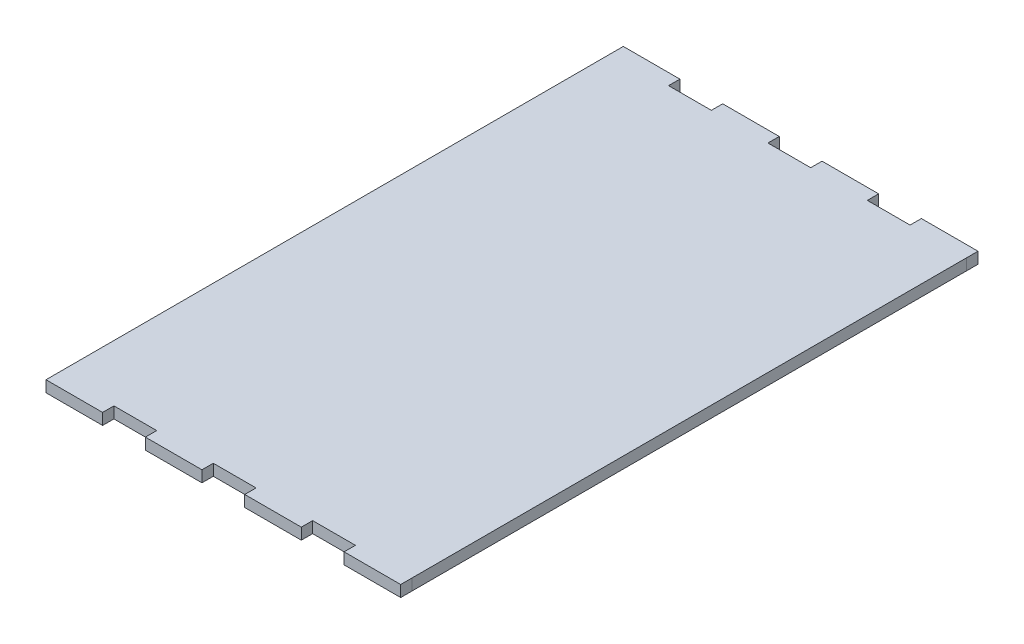
ISO-10303-21;
HEADER;
FILE_DESCRIPTION(('STEP AP214'),'2;1');
FILE_NAME('part.step','',(''),(''),'','','');
FILE_SCHEMA(('AUTOMOTIVE_DESIGN { 1 0 10303 214 1 1 1 1 }'));
ENDSEC;
DATA;
#1=APPLICATION_CONTEXT('core data for automotive mechanical design processes');
#2=APPLICATION_PROTOCOL_DEFINITION('international standard','automotive_design',2000,#1);
#3=PRODUCT_CONTEXT('',#1,'mechanical');
#4=PRODUCT('Part','Part','',(#3));
#5=PRODUCT_RELATED_PRODUCT_CATEGORY('part','',(#4));
#6=PRODUCT_DEFINITION_FORMATION('','',#4);
#7=PRODUCT_DEFINITION_CONTEXT('part definition',#1,'design');
#8=PRODUCT_DEFINITION('design','',#6,#7);
#9=PRODUCT_DEFINITION_SHAPE('','',#8);
#10=(LENGTH_UNIT() NAMED_UNIT(*) SI_UNIT(.MILLI.,.METRE.));
#11=(NAMED_UNIT(*) PLANE_ANGLE_UNIT() SI_UNIT($,.RADIAN.));
#12=(NAMED_UNIT(*) SI_UNIT($,.STERADIAN.) SOLID_ANGLE_UNIT());
#13=UNCERTAINTY_MEASURE_WITH_UNIT(LENGTH_MEASURE(1.E-05),#10,'distance_accuracy_value','');
#14=(GEOMETRIC_REPRESENTATION_CONTEXT(3) GLOBAL_UNCERTAINTY_ASSIGNED_CONTEXT((#13)) GLOBAL_UNIT_ASSIGNED_CONTEXT((#10,
#11,#12)) REPRESENTATION_CONTEXT('',''));
#15=CARTESIAN_POINT('',(0.,0.,0.));
#16=DIRECTION('',(0.,0.,1.));
#17=DIRECTION('',(1.,0.,0.));
#18=AXIS2_PLACEMENT_3D('',#15,#16,#17);
#19=CARTESIAN_POINT('',(0.,6.,6.));
#20=DIRECTION('',(0.,0.,-1.));
#21=DIRECTION('',(-1.,0.,0.));
#22=AXIS2_PLACEMENT_3D('',#19,#20,#21);
#23=PLANE('',#22);
#24=DIRECTION('',(1.,0.,0.));
#25=VECTOR('',#24,1.);
#26=CARTESIAN_POINT('',(0.,0.,6.));
#27=LINE('',#26,#25);
#28=CARTESIAN_POINT('',(0.,0.,6.));
#29=VERTEX_POINT('',#28);
#30=CARTESIAN_POINT('',(30.,0.,6.));
#31=VERTEX_POINT('',#30);
#32=EDGE_CURVE('E291',#29,#31,#27,.T.);
#33=ORIENTED_EDGE('',*,*,#32,.T.);
#34=DIRECTION('',(0.,-1.,0.));
#35=VECTOR('',#34,1.);
#36=CARTESIAN_POINT('',(30.,6.,6.));
#37=LINE('',#36,#35);
#38=CARTESIAN_POINT('',(30.,6.,6.));
#39=VERTEX_POINT('',#38);
#40=EDGE_CURVE('E50',#39,#31,#37,.T.);
#41=ORIENTED_EDGE('',*,*,#40,.F.);
#42=DIRECTION('',(1.,0.,0.));
#43=VECTOR('',#42,1.);
#44=CARTESIAN_POINT('',(0.,6.,6.));
#45=LINE('',#44,#43);
#46=CARTESIAN_POINT('',(0.,6.,6.));
#47=VERTEX_POINT('',#46);
#48=EDGE_CURVE('E175',#47,#39,#45,.T.);
#49=ORIENTED_EDGE('',*,*,#48,.F.);
#50=DIRECTION('',(0.,-1.,0.));
#51=VECTOR('',#50,1.);
#52=CARTESIAN_POINT('',(0.,6.,6.));
#53=LINE('',#52,#51);
#54=EDGE_CURVE('E11',#47,#29,#53,.T.);
#55=ORIENTED_EDGE('',*,*,#54,.T.);
#56=EDGE_LOOP('',(#33,#41,#49,#55));
#57=FACE_BOUND('',#56,.T.);
#58=ADVANCED_FACE('F41',(#57),#23,.F.);
#59=CARTESIAN_POINT('',(30.,6.,0.));
#60=DIRECTION('',(-1.,0.,0.));
#61=DIRECTION('',(0.,0.,1.));
#62=AXIS2_PLACEMENT_3D('',#59,#60,#61);
#63=PLANE('',#62);
#64=DIRECTION('',(0.,0.,-1.));
#65=VECTOR('',#64,1.);
#66=CARTESIAN_POINT('',(30.,0.,0.));
#67=LINE('',#66,#65);
#68=CARTESIAN_POINT('',(30.,0.,0.));
#69=VERTEX_POINT('',#68);
#70=EDGE_CURVE('E294',#31,#69,#67,.T.);
#71=ORIENTED_EDGE('',*,*,#70,.T.);
#72=DIRECTION('',(0.,-1.,0.));
#73=VECTOR('',#72,1.);
#74=CARTESIAN_POINT('',(30.,6.,0.));
#75=LINE('',#74,#73);
#76=CARTESIAN_POINT('',(30.,6.,0.));
#77=VERTEX_POINT('',#76);
#78=EDGE_CURVE('E490',#77,#69,#75,.T.);
#79=ORIENTED_EDGE('',*,*,#78,.F.);
#80=DIRECTION('',(0.,0.,-1.));
#81=VECTOR('',#80,1.);
#82=CARTESIAN_POINT('',(30.,6.,0.));
#83=LINE('',#82,#81);
#84=EDGE_CURVE('E500',#39,#77,#83,.T.);
#85=ORIENTED_EDGE('',*,*,#84,.F.);
#86=ORIENTED_EDGE('',*,*,#40,.T.);
#87=EDGE_LOOP('',(#71,#79,#85,#86));
#88=FACE_BOUND('',#87,.T.);
#89=ADVANCED_FACE('F498',(#88),#63,.F.);
#90=CARTESIAN_POINT('',(30.,6.,0.));
#91=DIRECTION('',(0.,0.,-1.));
#92=DIRECTION('',(-1.,0.,0.));
#93=AXIS2_PLACEMENT_3D('',#90,#91,#92);
#94=PLANE('',#93);
#95=DIRECTION('',(1.,0.,0.));
#96=VECTOR('',#95,1.);
#97=CARTESIAN_POINT('',(30.,0.,0.));
#98=LINE('',#97,#96);
#99=CARTESIAN_POINT('',(52.67,0.,0.));
#100=VERTEX_POINT('',#99);
#101=EDGE_CURVE('E297',#69,#100,#98,.T.);
#102=ORIENTED_EDGE('',*,*,#101,.T.);
#103=DIRECTION('',(0.,-1.,0.));
#104=VECTOR('',#103,1.);
#105=CARTESIAN_POINT('',(52.67,6.,0.));
#106=LINE('',#105,#104);
#107=CARTESIAN_POINT('',(52.67,6.,0.));
#108=VERTEX_POINT('',#107);
#109=EDGE_CURVE('E486',#108,#100,#106,.T.);
#110=ORIENTED_EDGE('',*,*,#109,.F.);
#111=DIRECTION('',(1.,0.,0.));
#112=VECTOR('',#111,1.);
#113=CARTESIAN_POINT('',(30.,6.,0.));
#114=LINE('',#113,#112);
#115=EDGE_CURVE('E517',#77,#108,#114,.T.);
#116=ORIENTED_EDGE('',*,*,#115,.F.);
#117=ORIENTED_EDGE('',*,*,#78,.T.);
#118=EDGE_LOOP('',(#102,#110,#116,#117));
#119=FACE_BOUND('',#118,.T.);
#120=ADVANCED_FACE('F507',(#119),#94,.F.);
#121=CARTESIAN_POINT('',(52.67,6.,0.));
#122=DIRECTION('',(1.,0.,0.));
#123=DIRECTION('',(0.,0.,-1.));
#124=AXIS2_PLACEMENT_3D('',#121,#122,#123);
#125=PLANE('',#124);
#126=DIRECTION('',(0.,0.,1.));
#127=VECTOR('',#126,1.);
#128=CARTESIAN_POINT('',(52.67,0.,0.));
#129=LINE('',#128,#127);
#130=CARTESIAN_POINT('',(52.67,0.,6.));
#131=VERTEX_POINT('',#130);
#132=EDGE_CURVE('E300',#100,#131,#129,.T.);
#133=ORIENTED_EDGE('',*,*,#132,.T.);
#134=DIRECTION('',(0.,-1.,0.));
#135=VECTOR('',#134,1.);
#136=CARTESIAN_POINT('',(52.67,6.,6.));
#137=LINE('',#136,#135);
#138=CARTESIAN_POINT('',(52.67,6.,6.));
#139=VERTEX_POINT('',#138);
#140=EDGE_CURVE('E482',#139,#131,#137,.T.);
#141=ORIENTED_EDGE('',*,*,#140,.F.);
#142=DIRECTION('',(0.,0.,1.));
#143=VECTOR('',#142,1.);
#144=CARTESIAN_POINT('',(52.67,6.,0.));
#145=LINE('',#144,#143);
#146=EDGE_CURVE('E513',#108,#139,#145,.T.);
#147=ORIENTED_EDGE('',*,*,#146,.F.);
#148=ORIENTED_EDGE('',*,*,#109,.T.);
#149=EDGE_LOOP('',(#133,#141,#147,#148));
#150=FACE_BOUND('',#149,.T.);
#151=ADVANCED_FACE('F511',(#150),#125,.F.);
#152=CARTESIAN_POINT('',(52.67,6.,6.));
#153=DIRECTION('',(0.,0.,-1.));
#154=DIRECTION('',(-1.,0.,0.));
#155=AXIS2_PLACEMENT_3D('',#152,#153,#154);
#156=PLANE('',#155);
#157=DIRECTION('',(1.,0.,0.));
#158=VECTOR('',#157,1.);
#159=CARTESIAN_POINT('',(52.67,0.,6.));
#160=LINE('',#159,#158);
#161=CARTESIAN_POINT('',(82.67,0.,6.));
#162=VERTEX_POINT('',#161);
#163=EDGE_CURVE('E303',#131,#162,#160,.T.);
#164=ORIENTED_EDGE('',*,*,#163,.T.);
#165=DIRECTION('',(0.,-1.,0.));
#166=VECTOR('',#165,1.);
#167=CARTESIAN_POINT('',(82.67,6.,6.));
#168=LINE('',#167,#166);
#169=CARTESIAN_POINT('',(82.67,6.,6.));
#170=VERTEX_POINT('',#169);
#171=EDGE_CURVE('E478',#170,#162,#168,.T.);
#172=ORIENTED_EDGE('',*,*,#171,.F.);
#173=DIRECTION('',(1.,0.,0.));
#174=VECTOR('',#173,1.);
#175=CARTESIAN_POINT('',(52.67,6.,6.));
#176=LINE('',#175,#174);
#177=EDGE_CURVE('E516',#139,#170,#176,.T.);
#178=ORIENTED_EDGE('',*,*,#177,.F.);
#179=ORIENTED_EDGE('',*,*,#140,.T.);
#180=EDGE_LOOP('',(#164,#172,#178,#179));
#181=FACE_BOUND('',#180,.T.);
#182=ADVANCED_FACE('F616',(#181),#156,.F.);
#183=CARTESIAN_POINT('',(82.67,6.,0.));
#184=DIRECTION('',(-1.,0.,0.));
#185=DIRECTION('',(0.,0.,1.));
#186=AXIS2_PLACEMENT_3D('',#183,#184,#185);
#187=PLANE('',#186);
#188=DIRECTION('',(0.,0.,-1.));
#189=VECTOR('',#188,1.);
#190=CARTESIAN_POINT('',(82.67,0.,0.));
#191=LINE('',#190,#189);
#192=CARTESIAN_POINT('',(82.67,0.,0.));
#193=VERTEX_POINT('',#192);
#194=EDGE_CURVE('E306',#162,#193,#191,.T.);
#195=ORIENTED_EDGE('',*,*,#194,.T.);
#196=DIRECTION('',(0.,-1.,0.));
#197=VECTOR('',#196,1.);
#198=CARTESIAN_POINT('',(82.67,6.,0.));
#199=LINE('',#198,#197);
#200=CARTESIAN_POINT('',(82.67,6.,0.));
#201=VERTEX_POINT('',#200);
#202=EDGE_CURVE('E474',#201,#193,#199,.T.);
#203=ORIENTED_EDGE('',*,*,#202,.F.);
#204=DIRECTION('',(0.,0.,-1.));
#205=VECTOR('',#204,1.);
#206=CARTESIAN_POINT('',(82.67,6.,0.));
#207=LINE('',#206,#205);
#208=EDGE_CURVE('E521',#170,#201,#207,.T.);
#209=ORIENTED_EDGE('',*,*,#208,.F.);
#210=ORIENTED_EDGE('',*,*,#171,.T.);
#211=EDGE_LOOP('',(#195,#203,#209,#210));
#212=FACE_BOUND('',#211,.T.);
#213=ADVANCED_FACE('F619',(#212),#187,.F.);
#214=CARTESIAN_POINT('',(82.67,6.,0.));
#215=DIRECTION('',(0.,0.,-1.));
#216=DIRECTION('',(-1.,0.,0.));
#217=AXIS2_PLACEMENT_3D('',#214,#215,#216);
#218=PLANE('',#217);
#219=DIRECTION('',(1.,0.,0.));
#220=VECTOR('',#219,1.);
#221=CARTESIAN_POINT('',(82.67,0.,0.));
#222=LINE('',#221,#220);
#223=CARTESIAN_POINT('',(105.34,0.,0.));
#224=VERTEX_POINT('',#223);
#225=EDGE_CURVE('E309',#193,#224,#222,.T.);
#226=ORIENTED_EDGE('',*,*,#225,.T.);
#227=DIRECTION('',(0.,-1.,0.));
#228=VECTOR('',#227,1.);
#229=CARTESIAN_POINT('',(105.34,6.,0.));
#230=LINE('',#229,#228);
#231=CARTESIAN_POINT('',(105.34,6.,0.));
#232=VERTEX_POINT('',#231);
#233=EDGE_CURVE('E470',#232,#224,#230,.T.);
#234=ORIENTED_EDGE('',*,*,#233,.F.);
#235=DIRECTION('',(1.,0.,0.));
#236=VECTOR('',#235,1.);
#237=CARTESIAN_POINT('',(82.67,6.,0.));
#238=LINE('',#237,#236);
#239=EDGE_CURVE('E528',#201,#232,#238,.T.);
#240=ORIENTED_EDGE('',*,*,#239,.F.);
#241=ORIENTED_EDGE('',*,*,#202,.T.);
#242=EDGE_LOOP('',(#226,#234,#240,#241));
#243=FACE_BOUND('',#242,.T.);
#244=ADVANCED_FACE('F623',(#243),#218,.F.);
#245=CARTESIAN_POINT('',(105.34,6.,0.));
#246=DIRECTION('',(1.,0.,0.));
#247=DIRECTION('',(0.,0.,-1.));
#248=AXIS2_PLACEMENT_3D('',#245,#246,#247);
#249=PLANE('',#248);
#250=DIRECTION('',(0.,0.,1.));
#251=VECTOR('',#250,1.);
#252=CARTESIAN_POINT('',(105.34,0.,0.));
#253=LINE('',#252,#251);
#254=CARTESIAN_POINT('',(105.34,0.,6.));
#255=VERTEX_POINT('',#254);
#256=EDGE_CURVE('E312',#224,#255,#253,.T.);
#257=ORIENTED_EDGE('',*,*,#256,.T.);
#258=DIRECTION('',(0.,-1.,0.));
#259=VECTOR('',#258,1.);
#260=CARTESIAN_POINT('',(105.34,6.,6.));
#261=LINE('',#260,#259);
#262=CARTESIAN_POINT('',(105.34,6.,6.));
#263=VERTEX_POINT('',#262);
#264=EDGE_CURVE('E466',#263,#255,#261,.T.);
#265=ORIENTED_EDGE('',*,*,#264,.F.);
#266=DIRECTION('',(0.,0.,1.));
#267=VECTOR('',#266,1.);
#268=CARTESIAN_POINT('',(105.34,6.,0.));
#269=LINE('',#268,#267);
#270=EDGE_CURVE('E531',#232,#263,#269,.T.);
#271=ORIENTED_EDGE('',*,*,#270,.F.);
#272=ORIENTED_EDGE('',*,*,#233,.T.);
#273=EDGE_LOOP('',(#257,#265,#271,#272));
#274=FACE_BOUND('',#273,.T.);
#275=ADVANCED_FACE('F627',(#274),#249,.F.);
#276=CARTESIAN_POINT('',(105.34,6.,6.));
#277=DIRECTION('',(0.,0.,-1.));
#278=DIRECTION('',(-1.,0.,0.));
#279=AXIS2_PLACEMENT_3D('',#276,#277,#278);
#280=PLANE('',#279);
#281=DIRECTION('',(1.,0.,0.));
#282=VECTOR('',#281,1.);
#283=CARTESIAN_POINT('',(105.34,0.,6.));
#284=LINE('',#283,#282);
#285=CARTESIAN_POINT('',(135.34,0.,6.));
#286=VERTEX_POINT('',#285);
#287=EDGE_CURVE('E315',#255,#286,#284,.T.);
#288=ORIENTED_EDGE('',*,*,#287,.T.);
#289=DIRECTION('',(0.,-1.,0.));
#290=VECTOR('',#289,1.);
#291=CARTESIAN_POINT('',(135.34,6.,6.));
#292=LINE('',#291,#290);
#293=CARTESIAN_POINT('',(135.34,6.,6.));
#294=VERTEX_POINT('',#293);
#295=EDGE_CURVE('E462',#294,#286,#292,.T.);
#296=ORIENTED_EDGE('',*,*,#295,.F.);
#297=DIRECTION('',(1.,0.,0.));
#298=VECTOR('',#297,1.);
#299=CARTESIAN_POINT('',(105.34,6.,6.));
#300=LINE('',#299,#298);
#301=EDGE_CURVE('E534',#263,#294,#300,.T.);
#302=ORIENTED_EDGE('',*,*,#301,.F.);
#303=ORIENTED_EDGE('',*,*,#264,.T.);
#304=EDGE_LOOP('',(#288,#296,#302,#303));
#305=FACE_BOUND('',#304,.T.);
#306=ADVANCED_FACE('F631',(#305),#280,.F.);
#307=CARTESIAN_POINT('',(135.34,6.,0.));
#308=DIRECTION('',(-1.,0.,0.));
#309=DIRECTION('',(0.,0.,1.));
#310=AXIS2_PLACEMENT_3D('',#307,#308,#309);
#311=PLANE('',#310);
#312=DIRECTION('',(0.,0.,-1.));
#313=VECTOR('',#312,1.);
#314=CARTESIAN_POINT('',(135.34,0.,0.));
#315=LINE('',#314,#313);
#316=CARTESIAN_POINT('',(135.34,0.,0.));
#317=VERTEX_POINT('',#316);
#318=EDGE_CURVE('E318',#286,#317,#315,.T.);
#319=ORIENTED_EDGE('',*,*,#318,.T.);
#320=DIRECTION('',(0.,-1.,0.));
#321=VECTOR('',#320,1.);
#322=CARTESIAN_POINT('',(135.34,6.,0.));
#323=LINE('',#322,#321);
#324=CARTESIAN_POINT('',(135.34,6.,0.));
#325=VERTEX_POINT('',#324);
#326=EDGE_CURVE('E458',#325,#317,#323,.T.);
#327=ORIENTED_EDGE('',*,*,#326,.F.);
#328=DIRECTION('',(0.,0.,-1.));
#329=VECTOR('',#328,1.);
#330=CARTESIAN_POINT('',(135.34,6.,0.));
#331=LINE('',#330,#329);
#332=EDGE_CURVE('E537',#294,#325,#331,.T.);
#333=ORIENTED_EDGE('',*,*,#332,.F.);
#334=ORIENTED_EDGE('',*,*,#295,.T.);
#335=EDGE_LOOP('',(#319,#327,#333,#334));
#336=FACE_BOUND('',#335,.T.);
#337=ADVANCED_FACE('F635',(#336),#311,.F.);
#338=CARTESIAN_POINT('',(135.34,6.,0.));
#339=DIRECTION('',(0.,0.,-1.));
#340=DIRECTION('',(-1.,0.,0.));
#341=AXIS2_PLACEMENT_3D('',#338,#339,#340);
#342=PLANE('',#341);
#343=DIRECTION('',(1.,0.,0.));
#344=VECTOR('',#343,1.);
#345=CARTESIAN_POINT('',(135.34,0.,0.));
#346=LINE('',#345,#344);
#347=CARTESIAN_POINT('',(158.01,0.,0.));
#348=VERTEX_POINT('',#347);
#349=EDGE_CURVE('E321',#317,#348,#346,.T.);
#350=ORIENTED_EDGE('',*,*,#349,.T.);
#351=DIRECTION('',(0.,-1.,0.));
#352=VECTOR('',#351,1.);
#353=CARTESIAN_POINT('',(158.01,6.,0.));
#354=LINE('',#353,#352);
#355=CARTESIAN_POINT('',(158.01,6.,0.));
#356=VERTEX_POINT('',#355);
#357=EDGE_CURVE('E454',#356,#348,#354,.T.);
#358=ORIENTED_EDGE('',*,*,#357,.F.);
#359=DIRECTION('',(1.,0.,0.));
#360=VECTOR('',#359,1.);
#361=CARTESIAN_POINT('',(135.34,6.,0.));
#362=LINE('',#361,#360);
#363=EDGE_CURVE('E540',#325,#356,#362,.T.);
#364=ORIENTED_EDGE('',*,*,#363,.F.);
#365=ORIENTED_EDGE('',*,*,#326,.T.);
#366=EDGE_LOOP('',(#350,#358,#364,#365));
#367=FACE_BOUND('',#366,.T.);
#368=ADVANCED_FACE('F639',(#367),#342,.F.);
#369=CARTESIAN_POINT('',(158.01,6.,0.));
#370=DIRECTION('',(1.,0.,0.));
#371=DIRECTION('',(0.,0.,-1.));
#372=AXIS2_PLACEMENT_3D('',#369,#370,#371);
#373=PLANE('',#372);
#374=DIRECTION('',(0.,0.,1.));
#375=VECTOR('',#374,1.);
#376=CARTESIAN_POINT('',(158.01,0.,0.));
#377=LINE('',#376,#375);
#378=CARTESIAN_POINT('',(158.01,0.,6.));
#379=VERTEX_POINT('',#378);
#380=EDGE_CURVE('E324',#348,#379,#377,.T.);
#381=ORIENTED_EDGE('',*,*,#380,.T.);
#382=DIRECTION('',(0.,-1.,0.));
#383=VECTOR('',#382,1.);
#384=CARTESIAN_POINT('',(158.01,6.,6.));
#385=LINE('',#384,#383);
#386=CARTESIAN_POINT('',(158.01,6.,6.));
#387=VERTEX_POINT('',#386);
#388=EDGE_CURVE('E450',#387,#379,#385,.T.);
#389=ORIENTED_EDGE('',*,*,#388,.F.);
#390=DIRECTION('',(0.,0.,1.));
#391=VECTOR('',#390,1.);
#392=CARTESIAN_POINT('',(158.01,6.,0.));
#393=LINE('',#392,#391);
#394=EDGE_CURVE('E543',#356,#387,#393,.T.);
#395=ORIENTED_EDGE('',*,*,#394,.F.);
#396=ORIENTED_EDGE('',*,*,#357,.T.);
#397=EDGE_LOOP('',(#381,#389,#395,#396));
#398=FACE_BOUND('',#397,.T.);
#399=ADVANCED_FACE('F643',(#398),#373,.F.);
#400=CARTESIAN_POINT('',(158.01,6.,6.));
#401=DIRECTION('',(0.,0.,-1.));
#402=DIRECTION('',(-1.,0.,0.));
#403=AXIS2_PLACEMENT_3D('',#400,#401,#402);
#404=PLANE('',#403);
#405=DIRECTION('',(1.,0.,0.));
#406=VECTOR('',#405,1.);
#407=CARTESIAN_POINT('',(158.01,0.,6.));
#408=LINE('',#407,#406);
#409=CARTESIAN_POINT('',(188.01,0.,6.));
#410=VERTEX_POINT('',#409);
#411=EDGE_CURVE('E327',#379,#410,#408,.T.);
#412=ORIENTED_EDGE('',*,*,#411,.T.);
#413=DIRECTION('',(0.,-1.,0.));
#414=VECTOR('',#413,1.);
#415=CARTESIAN_POINT('',(188.01,6.,6.));
#416=LINE('',#415,#414);
#417=CARTESIAN_POINT('',(188.01,6.,6.));
#418=VERTEX_POINT('',#417);
#419=EDGE_CURVE('E446',#418,#410,#416,.T.);
#420=ORIENTED_EDGE('',*,*,#419,.F.);
#421=DIRECTION('',(1.,0.,0.));
#422=VECTOR('',#421,1.);
#423=CARTESIAN_POINT('',(158.01,6.,6.));
#424=LINE('',#423,#422);
#425=EDGE_CURVE('E546',#387,#418,#424,.T.);
#426=ORIENTED_EDGE('',*,*,#425,.F.);
#427=ORIENTED_EDGE('',*,*,#388,.T.);
#428=EDGE_LOOP('',(#412,#420,#426,#427));
#429=FACE_BOUND('',#428,.T.);
#430=ADVANCED_FACE('F647',(#429),#404,.F.);
#431=CARTESIAN_POINT('',(188.01,6.,0.));
#432=DIRECTION('',(-1.,0.,0.));
#433=DIRECTION('',(0.,0.,1.));
#434=AXIS2_PLACEMENT_3D('',#431,#432,#433);
#435=PLANE('',#434);
#436=DIRECTION('',(0.,0.,-1.));
#437=VECTOR('',#436,1.);
#438=CARTESIAN_POINT('',(188.01,0.,0.));
#439=LINE('',#438,#437);
#440=CARTESIAN_POINT('',(188.01,0.,0.));
#441=VERTEX_POINT('',#440);
#442=EDGE_CURVE('E330',#410,#441,#439,.T.);
#443=ORIENTED_EDGE('',*,*,#442,.T.);
#444=DIRECTION('',(0.,-1.,0.));
#445=VECTOR('',#444,1.);
#446=CARTESIAN_POINT('',(188.01,6.,0.));
#447=LINE('',#446,#445);
#448=CARTESIAN_POINT('',(188.01,6.,0.));
#449=VERTEX_POINT('',#448);
#450=EDGE_CURVE('E442',#449,#441,#447,.T.);
#451=ORIENTED_EDGE('',*,*,#450,.F.);
#452=DIRECTION('',(0.,0.,-1.));
#453=VECTOR('',#452,1.);
#454=CARTESIAN_POINT('',(188.01,6.,0.));
#455=LINE('',#454,#453);
#456=EDGE_CURVE('E549',#418,#449,#455,.T.);
#457=ORIENTED_EDGE('',*,*,#456,.F.);
#458=ORIENTED_EDGE('',*,*,#419,.T.);
#459=EDGE_LOOP('',(#443,#451,#457,#458));
#460=FACE_BOUND('',#459,.T.);
#461=ADVANCED_FACE('F651',(#460),#435,.F.);
#462=CARTESIAN_POINT('',(188.,6.,0.));
#463=DIRECTION('',(0.,0.,1.));
#464=DIRECTION('',(1.,0.,0.));
#465=AXIS2_PLACEMENT_3D('',#462,#463,#464);
#466=PLANE('',#465);
#467=DIRECTION('',(-1.,0.,0.));
#468=VECTOR('',#467,1.);
#469=CARTESIAN_POINT('',(188.,0.,0.));
#470=LINE('',#469,#468);
#471=CARTESIAN_POINT('',(188.,0.,0.));
#472=VERTEX_POINT('',#471);
#473=EDGE_CURVE('E333',#441,#472,#470,.T.);
#474=ORIENTED_EDGE('',*,*,#473,.T.);
#475=DIRECTION('',(0.,-1.,0.));
#476=VECTOR('',#475,1.);
#477=CARTESIAN_POINT('',(188.,6.,0.));
#478=LINE('',#477,#476);
#479=CARTESIAN_POINT('',(188.,6.,0.));
#480=VERTEX_POINT('',#479);
#481=EDGE_CURVE('E438',#480,#472,#478,.T.);
#482=ORIENTED_EDGE('',*,*,#481,.F.);
#483=DIRECTION('',(-1.,0.,0.));
#484=VECTOR('',#483,1.);
#485=CARTESIAN_POINT('',(188.,6.,0.));
#486=LINE('',#485,#484);
#487=EDGE_CURVE('E552',#449,#480,#486,.T.);
#488=ORIENTED_EDGE('',*,*,#487,.F.);
#489=ORIENTED_EDGE('',*,*,#450,.T.);
#490=EDGE_LOOP('',(#474,#482,#488,#489));
#491=FACE_BOUND('',#490,.T.);
#492=ADVANCED_FACE('F655',(#491),#466,.F.);
#493=CARTESIAN_POINT('',(188.,6.,0.));
#494=DIRECTION('',(-1.,0.,0.));
#495=DIRECTION('',(0.,0.,1.));
#496=AXIS2_PLACEMENT_3D('',#493,#494,#495);
#497=PLANE('',#496);
#498=DIRECTION('',(0.,0.,-1.));
#499=VECTOR('',#498,1.);
#500=CARTESIAN_POINT('',(188.,0.,0.));
#501=LINE('',#500,#499);
#502=CARTESIAN_POINT('',(188.,0.,-294.));
#503=VERTEX_POINT('',#502);
#504=EDGE_CURVE('E336',#472,#503,#501,.T.);
#505=ORIENTED_EDGE('',*,*,#504,.T.);
#506=DIRECTION('',(0.,-1.,0.));
#507=VECTOR('',#506,1.);
#508=CARTESIAN_POINT('',(188.,6.,-294.));
#509=LINE('',#508,#507);
#510=CARTESIAN_POINT('',(188.,6.,-294.));
#511=VERTEX_POINT('',#510);
#512=EDGE_CURVE('E434',#511,#503,#509,.T.);
#513=ORIENTED_EDGE('',*,*,#512,.F.);
#514=DIRECTION('',(0.,0.,-1.));
#515=VECTOR('',#514,1.);
#516=CARTESIAN_POINT('',(188.,6.,0.));
#517=LINE('',#516,#515);
#518=EDGE_CURVE('E555',#480,#511,#517,.T.);
#519=ORIENTED_EDGE('',*,*,#518,.F.);
#520=ORIENTED_EDGE('',*,*,#481,.T.);
#521=EDGE_LOOP('',(#505,#513,#519,#520));
#522=FACE_BOUND('',#521,.T.);
#523=ADVANCED_FACE('F659',(#522),#497,.F.);
#524=CARTESIAN_POINT('',(188.,6.,-294.));
#525=DIRECTION('',(0.,0.,-1.));
#526=DIRECTION('',(-1.,0.,0.));
#527=AXIS2_PLACEMENT_3D('',#524,#525,#526);
#528=PLANE('',#527);
#529=DIRECTION('',(1.,0.,0.));
#530=VECTOR('',#529,1.);
#531=CARTESIAN_POINT('',(188.,0.,-294.));
#532=LINE('',#531,#530);
#533=CARTESIAN_POINT('',(188.01,0.,-294.));
#534=VERTEX_POINT('',#533);
#535=EDGE_CURVE('E339',#503,#534,#532,.T.);
#536=ORIENTED_EDGE('',*,*,#535,.T.);
#537=DIRECTION('',(0.,-1.,0.));
#538=VECTOR('',#537,1.);
#539=CARTESIAN_POINT('',(188.01,6.,-294.));
#540=LINE('',#539,#538);
#541=CARTESIAN_POINT('',(188.01,6.,-294.));
#542=VERTEX_POINT('',#541);
#543=EDGE_CURVE('E430',#542,#534,#540,.T.);
#544=ORIENTED_EDGE('',*,*,#543,.F.);
#545=DIRECTION('',(1.,0.,0.));
#546=VECTOR('',#545,1.);
#547=CARTESIAN_POINT('',(188.,6.,-294.));
#548=LINE('',#547,#546);
#549=EDGE_CURVE('E558',#511,#542,#548,.T.);
#550=ORIENTED_EDGE('',*,*,#549,.F.);
#551=ORIENTED_EDGE('',*,*,#512,.T.);
#552=EDGE_LOOP('',(#536,#544,#550,#551));
#553=FACE_BOUND('',#552,.T.);
#554=ADVANCED_FACE('F663',(#553),#528,.F.);
#555=CARTESIAN_POINT('',(188.01,6.,-294.));
#556=DIRECTION('',(-1.,0.,0.));
#557=DIRECTION('',(0.,0.,1.));
#558=AXIS2_PLACEMENT_3D('',#555,#556,#557);
#559=PLANE('',#558);
#560=DIRECTION('',(0.,0.,-1.));
#561=VECTOR('',#560,1.);
#562=CARTESIAN_POINT('',(188.01,0.,-294.));
#563=LINE('',#562,#561);
#564=CARTESIAN_POINT('',(188.01,0.,-300.));
#565=VERTEX_POINT('',#564);
#566=EDGE_CURVE('E342',#534,#565,#563,.T.);
#567=ORIENTED_EDGE('',*,*,#566,.T.);
#568=DIRECTION('',(0.,-1.,0.));
#569=VECTOR('',#568,1.);
#570=CARTESIAN_POINT('',(188.01,6.,-300.));
#571=LINE('',#570,#569);
#572=CARTESIAN_POINT('',(188.01,6.,-300.));
#573=VERTEX_POINT('',#572);
#574=EDGE_CURVE('E426',#573,#565,#571,.T.);
#575=ORIENTED_EDGE('',*,*,#574,.F.);
#576=DIRECTION('',(0.,0.,-1.));
#577=VECTOR('',#576,1.);
#578=CARTESIAN_POINT('',(188.01,6.,-294.));
#579=LINE('',#578,#577);
#580=EDGE_CURVE('E561',#542,#573,#579,.T.);
#581=ORIENTED_EDGE('',*,*,#580,.F.);
#582=ORIENTED_EDGE('',*,*,#543,.T.);
#583=EDGE_LOOP('',(#567,#575,#581,#582));
#584=FACE_BOUND('',#583,.T.);
#585=ADVANCED_FACE('F667',(#584),#559,.F.);
#586=CARTESIAN_POINT('',(158.01,6.,-300.));
#587=DIRECTION('',(0.,0.,1.));
#588=DIRECTION('',(1.,0.,0.));
#589=AXIS2_PLACEMENT_3D('',#586,#587,#588);
#590=PLANE('',#589);
#591=DIRECTION('',(-1.,0.,0.));
#592=VECTOR('',#591,1.);
#593=CARTESIAN_POINT('',(158.01,0.,-300.));
#594=LINE('',#593,#592);
#595=CARTESIAN_POINT('',(158.01,0.,-300.));
#596=VERTEX_POINT('',#595);
#597=EDGE_CURVE('E345',#565,#596,#594,.T.);
#598=ORIENTED_EDGE('',*,*,#597,.T.);
#599=DIRECTION('',(0.,-1.,0.));
#600=VECTOR('',#599,1.);
#601=CARTESIAN_POINT('',(158.01,6.,-300.));
#602=LINE('',#601,#600);
#603=CARTESIAN_POINT('',(158.01,6.,-300.));
#604=VERTEX_POINT('',#603);
#605=EDGE_CURVE('E422',#604,#596,#602,.T.);
#606=ORIENTED_EDGE('',*,*,#605,.F.);
#607=DIRECTION('',(-1.,0.,0.));
#608=VECTOR('',#607,1.);
#609=CARTESIAN_POINT('',(158.01,6.,-300.));
#610=LINE('',#609,#608);
#611=EDGE_CURVE('E564',#573,#604,#610,.T.);
#612=ORIENTED_EDGE('',*,*,#611,.F.);
#613=ORIENTED_EDGE('',*,*,#574,.T.);
#614=EDGE_LOOP('',(#598,#606,#612,#613));
#615=FACE_BOUND('',#614,.T.);
#616=ADVANCED_FACE('F671',(#615),#590,.F.);
#617=CARTESIAN_POINT('',(158.01,6.,-294.));
#618=DIRECTION('',(1.,0.,0.));
#619=DIRECTION('',(0.,0.,-1.));
#620=AXIS2_PLACEMENT_3D('',#617,#618,#619);
#621=PLANE('',#620);
#622=DIRECTION('',(0.,0.,1.));
#623=VECTOR('',#622,1.);
#624=CARTESIAN_POINT('',(158.01,0.,-294.));
#625=LINE('',#624,#623);
#626=CARTESIAN_POINT('',(158.01,0.,-294.));
#627=VERTEX_POINT('',#626);
#628=EDGE_CURVE('E348',#596,#627,#625,.T.);
#629=ORIENTED_EDGE('',*,*,#628,.T.);
#630=DIRECTION('',(0.,-1.,0.));
#631=VECTOR('',#630,1.);
#632=CARTESIAN_POINT('',(158.01,6.,-294.));
#633=LINE('',#632,#631);
#634=CARTESIAN_POINT('',(158.01,6.,-294.));
#635=VERTEX_POINT('',#634);
#636=EDGE_CURVE('E418',#635,#627,#633,.T.);
#637=ORIENTED_EDGE('',*,*,#636,.F.);
#638=DIRECTION('',(0.,0.,1.));
#639=VECTOR('',#638,1.);
#640=CARTESIAN_POINT('',(158.01,6.,-294.));
#641=LINE('',#640,#639);
#642=EDGE_CURVE('E567',#604,#635,#641,.T.);
#643=ORIENTED_EDGE('',*,*,#642,.F.);
#644=ORIENTED_EDGE('',*,*,#605,.T.);
#645=EDGE_LOOP('',(#629,#637,#643,#644));
#646=FACE_BOUND('',#645,.T.);
#647=ADVANCED_FACE('F675',(#646),#621,.F.);
#648=CARTESIAN_POINT('',(135.34,6.,-294.));
#649=DIRECTION('',(0.,0.,1.));
#650=DIRECTION('',(1.,0.,0.));
#651=AXIS2_PLACEMENT_3D('',#648,#649,#650);
#652=PLANE('',#651);
#653=DIRECTION('',(-1.,0.,0.));
#654=VECTOR('',#653,1.);
#655=CARTESIAN_POINT('',(135.34,0.,-294.));
#656=LINE('',#655,#654);
#657=CARTESIAN_POINT('',(135.34,0.,-294.));
#658=VERTEX_POINT('',#657);
#659=EDGE_CURVE('E351',#627,#658,#656,.T.);
#660=ORIENTED_EDGE('',*,*,#659,.T.);
#661=DIRECTION('',(0.,-1.,0.));
#662=VECTOR('',#661,1.);
#663=CARTESIAN_POINT('',(135.34,6.,-294.));
#664=LINE('',#663,#662);
#665=CARTESIAN_POINT('',(135.34,6.,-294.));
#666=VERTEX_POINT('',#665);
#667=EDGE_CURVE('E414',#666,#658,#664,.T.);
#668=ORIENTED_EDGE('',*,*,#667,.F.);
#669=DIRECTION('',(-1.,0.,0.));
#670=VECTOR('',#669,1.);
#671=CARTESIAN_POINT('',(135.34,6.,-294.));
#672=LINE('',#671,#670);
#673=EDGE_CURVE('E570',#635,#666,#672,.T.);
#674=ORIENTED_EDGE('',*,*,#673,.F.);
#675=ORIENTED_EDGE('',*,*,#636,.T.);
#676=EDGE_LOOP('',(#660,#668,#674,#675));
#677=FACE_BOUND('',#676,.T.);
#678=ADVANCED_FACE('F679',(#677),#652,.F.);
#679=CARTESIAN_POINT('',(135.34,6.,-294.));
#680=DIRECTION('',(-1.,0.,0.));
#681=DIRECTION('',(0.,0.,1.));
#682=AXIS2_PLACEMENT_3D('',#679,#680,#681);
#683=PLANE('',#682);
#684=DIRECTION('',(0.,0.,-1.));
#685=VECTOR('',#684,1.);
#686=CARTESIAN_POINT('',(135.34,0.,-294.));
#687=LINE('',#686,#685);
#688=CARTESIAN_POINT('',(135.34,0.,-300.));
#689=VERTEX_POINT('',#688);
#690=EDGE_CURVE('E354',#658,#689,#687,.T.);
#691=ORIENTED_EDGE('',*,*,#690,.T.);
#692=DIRECTION('',(0.,-1.,0.));
#693=VECTOR('',#692,1.);
#694=CARTESIAN_POINT('',(135.34,6.,-300.));
#695=LINE('',#694,#693);
#696=CARTESIAN_POINT('',(135.34,6.,-300.));
#697=VERTEX_POINT('',#696);
#698=EDGE_CURVE('E410',#697,#689,#695,.T.);
#699=ORIENTED_EDGE('',*,*,#698,.F.);
#700=DIRECTION('',(0.,0.,-1.));
#701=VECTOR('',#700,1.);
#702=CARTESIAN_POINT('',(135.34,6.,-294.));
#703=LINE('',#702,#701);
#704=EDGE_CURVE('E573',#666,#697,#703,.T.);
#705=ORIENTED_EDGE('',*,*,#704,.F.);
#706=ORIENTED_EDGE('',*,*,#667,.T.);
#707=EDGE_LOOP('',(#691,#699,#705,#706));
#708=FACE_BOUND('',#707,.T.);
#709=ADVANCED_FACE('F683',(#708),#683,.F.);
#710=CARTESIAN_POINT('',(105.34,6.,-300.));
#711=DIRECTION('',(0.,0.,1.));
#712=DIRECTION('',(1.,0.,0.));
#713=AXIS2_PLACEMENT_3D('',#710,#711,#712);
#714=PLANE('',#713);
#715=DIRECTION('',(-1.,0.,0.));
#716=VECTOR('',#715,1.);
#717=CARTESIAN_POINT('',(105.34,0.,-300.));
#718=LINE('',#717,#716);
#719=CARTESIAN_POINT('',(105.34,0.,-300.));
#720=VERTEX_POINT('',#719);
#721=EDGE_CURVE('E357',#689,#720,#718,.T.);
#722=ORIENTED_EDGE('',*,*,#721,.T.);
#723=DIRECTION('',(0.,-1.,0.));
#724=VECTOR('',#723,1.);
#725=CARTESIAN_POINT('',(105.34,6.,-300.));
#726=LINE('',#725,#724);
#727=CARTESIAN_POINT('',(105.34,6.,-300.));
#728=VERTEX_POINT('',#727);
#729=EDGE_CURVE('E406',#728,#720,#726,.T.);
#730=ORIENTED_EDGE('',*,*,#729,.F.);
#731=DIRECTION('',(-1.,0.,0.));
#732=VECTOR('',#731,1.);
#733=CARTESIAN_POINT('',(105.34,6.,-300.));
#734=LINE('',#733,#732);
#735=EDGE_CURVE('E576',#697,#728,#734,.T.);
#736=ORIENTED_EDGE('',*,*,#735,.F.);
#737=ORIENTED_EDGE('',*,*,#698,.T.);
#738=EDGE_LOOP('',(#722,#730,#736,#737));
#739=FACE_BOUND('',#738,.T.);
#740=ADVANCED_FACE('F687',(#739),#714,.F.);
#741=CARTESIAN_POINT('',(105.34,6.,-294.));
#742=DIRECTION('',(1.,0.,0.));
#743=DIRECTION('',(0.,0.,-1.));
#744=AXIS2_PLACEMENT_3D('',#741,#742,#743);
#745=PLANE('',#744);
#746=DIRECTION('',(0.,0.,1.));
#747=VECTOR('',#746,1.);
#748=CARTESIAN_POINT('',(105.34,0.,-294.));
#749=LINE('',#748,#747);
#750=CARTESIAN_POINT('',(105.34,0.,-294.));
#751=VERTEX_POINT('',#750);
#752=EDGE_CURVE('E360',#720,#751,#749,.T.);
#753=ORIENTED_EDGE('',*,*,#752,.T.);
#754=DIRECTION('',(0.,-1.,0.));
#755=VECTOR('',#754,1.);
#756=CARTESIAN_POINT('',(105.34,6.,-294.));
#757=LINE('',#756,#755);
#758=CARTESIAN_POINT('',(105.34,6.,-294.));
#759=VERTEX_POINT('',#758);
#760=EDGE_CURVE('E402',#759,#751,#757,.T.);
#761=ORIENTED_EDGE('',*,*,#760,.F.);
#762=DIRECTION('',(0.,0.,1.));
#763=VECTOR('',#762,1.);
#764=CARTESIAN_POINT('',(105.34,6.,-294.));
#765=LINE('',#764,#763);
#766=EDGE_CURVE('E579',#728,#759,#765,.T.);
#767=ORIENTED_EDGE('',*,*,#766,.F.);
#768=ORIENTED_EDGE('',*,*,#729,.T.);
#769=EDGE_LOOP('',(#753,#761,#767,#768));
#770=FACE_BOUND('',#769,.T.);
#771=ADVANCED_FACE('F691',(#770),#745,.F.);
#772=CARTESIAN_POINT('',(82.67,6.,-294.));
#773=DIRECTION('',(0.,0.,1.));
#774=DIRECTION('',(1.,0.,0.));
#775=AXIS2_PLACEMENT_3D('',#772,#773,#774);
#776=PLANE('',#775);
#777=DIRECTION('',(-1.,0.,0.));
#778=VECTOR('',#777,1.);
#779=CARTESIAN_POINT('',(82.67,0.,-294.));
#780=LINE('',#779,#778);
#781=CARTESIAN_POINT('',(82.67,0.,-294.));
#782=VERTEX_POINT('',#781);
#783=EDGE_CURVE('E363',#751,#782,#780,.T.);
#784=ORIENTED_EDGE('',*,*,#783,.T.);
#785=DIRECTION('',(0.,-1.,0.));
#786=VECTOR('',#785,1.);
#787=CARTESIAN_POINT('',(82.67,6.,-294.));
#788=LINE('',#787,#786);
#789=CARTESIAN_POINT('',(82.67,6.,-294.));
#790=VERTEX_POINT('',#789);
#791=EDGE_CURVE('E398',#790,#782,#788,.T.);
#792=ORIENTED_EDGE('',*,*,#791,.F.);
#793=DIRECTION('',(-1.,0.,0.));
#794=VECTOR('',#793,1.);
#795=CARTESIAN_POINT('',(82.67,6.,-294.));
#796=LINE('',#795,#794);
#797=EDGE_CURVE('E582',#759,#790,#796,.T.);
#798=ORIENTED_EDGE('',*,*,#797,.F.);
#799=ORIENTED_EDGE('',*,*,#760,.T.);
#800=EDGE_LOOP('',(#784,#792,#798,#799));
#801=FACE_BOUND('',#800,.T.);
#802=ADVANCED_FACE('F695',(#801),#776,.F.);
#803=CARTESIAN_POINT('',(82.67,6.,-294.));
#804=DIRECTION('',(-1.,0.,0.));
#805=DIRECTION('',(0.,0.,1.));
#806=AXIS2_PLACEMENT_3D('',#803,#804,#805);
#807=PLANE('',#806);
#808=DIRECTION('',(0.,0.,-1.));
#809=VECTOR('',#808,1.);
#810=CARTESIAN_POINT('',(82.67,0.,-294.));
#811=LINE('',#810,#809);
#812=CARTESIAN_POINT('',(82.67,0.,-300.));
#813=VERTEX_POINT('',#812);
#814=EDGE_CURVE('E366',#782,#813,#811,.T.);
#815=ORIENTED_EDGE('',*,*,#814,.T.);
#816=DIRECTION('',(0.,-1.,0.));
#817=VECTOR('',#816,1.);
#818=CARTESIAN_POINT('',(82.67,6.,-300.));
#819=LINE('',#818,#817);
#820=CARTESIAN_POINT('',(82.67,6.,-300.));
#821=VERTEX_POINT('',#820);
#822=EDGE_CURVE('E394',#821,#813,#819,.T.);
#823=ORIENTED_EDGE('',*,*,#822,.F.);
#824=DIRECTION('',(0.,0.,-1.));
#825=VECTOR('',#824,1.);
#826=CARTESIAN_POINT('',(82.67,6.,-294.));
#827=LINE('',#826,#825);
#828=EDGE_CURVE('E585',#790,#821,#827,.T.);
#829=ORIENTED_EDGE('',*,*,#828,.F.);
#830=ORIENTED_EDGE('',*,*,#791,.T.);
#831=EDGE_LOOP('',(#815,#823,#829,#830));
#832=FACE_BOUND('',#831,.T.);
#833=ADVANCED_FACE('F699',(#832),#807,.F.);
#834=CARTESIAN_POINT('',(52.67,6.,-300.));
#835=DIRECTION('',(0.,0.,1.));
#836=DIRECTION('',(1.,0.,0.));
#837=AXIS2_PLACEMENT_3D('',#834,#835,#836);
#838=PLANE('',#837);
#839=DIRECTION('',(-1.,0.,0.));
#840=VECTOR('',#839,1.);
#841=CARTESIAN_POINT('',(52.67,0.,-300.));
#842=LINE('',#841,#840);
#843=CARTESIAN_POINT('',(52.67,0.,-300.));
#844=VERTEX_POINT('',#843);
#845=EDGE_CURVE('E369',#813,#844,#842,.T.);
#846=ORIENTED_EDGE('',*,*,#845,.T.);
#847=DIRECTION('',(0.,-1.,0.));
#848=VECTOR('',#847,1.);
#849=CARTESIAN_POINT('',(52.67,6.,-300.));
#850=LINE('',#849,#848);
#851=CARTESIAN_POINT('',(52.67,6.,-300.));
#852=VERTEX_POINT('',#851);
#853=EDGE_CURVE('E390',#852,#844,#850,.T.);
#854=ORIENTED_EDGE('',*,*,#853,.F.);
#855=DIRECTION('',(-1.,0.,0.));
#856=VECTOR('',#855,1.);
#857=CARTESIAN_POINT('',(52.67,6.,-300.));
#858=LINE('',#857,#856);
#859=EDGE_CURVE('E588',#821,#852,#858,.T.);
#860=ORIENTED_EDGE('',*,*,#859,.F.);
#861=ORIENTED_EDGE('',*,*,#822,.T.);
#862=EDGE_LOOP('',(#846,#854,#860,#861));
#863=FACE_BOUND('',#862,.T.);
#864=ADVANCED_FACE('F596',(#863),#838,.F.);
#865=CARTESIAN_POINT('',(52.67,6.,-294.));
#866=DIRECTION('',(1.,0.,0.));
#867=DIRECTION('',(0.,0.,-1.));
#868=AXIS2_PLACEMENT_3D('',#865,#866,#867);
#869=PLANE('',#868);
#870=DIRECTION('',(0.,0.,1.));
#871=VECTOR('',#870,1.);
#872=CARTESIAN_POINT('',(52.67,0.,-294.));
#873=LINE('',#872,#871);
#874=CARTESIAN_POINT('',(52.67,0.,-294.));
#875=VERTEX_POINT('',#874);
#876=EDGE_CURVE('E372',#844,#875,#873,.T.);
#877=ORIENTED_EDGE('',*,*,#876,.T.);
#878=DIRECTION('',(0.,-1.,0.));
#879=VECTOR('',#878,1.);
#880=CARTESIAN_POINT('',(52.67,6.,-294.));
#881=LINE('',#880,#879);
#882=CARTESIAN_POINT('',(52.67,6.,-294.));
#883=VERTEX_POINT('',#882);
#884=EDGE_CURVE('E278',#883,#875,#881,.T.);
#885=ORIENTED_EDGE('',*,*,#884,.F.);
#886=DIRECTION('',(0.,0.,1.));
#887=VECTOR('',#886,1.);
#888=CARTESIAN_POINT('',(52.67,6.,-294.));
#889=LINE('',#888,#887);
#890=EDGE_CURVE('E267',#852,#883,#889,.T.);
#891=ORIENTED_EDGE('',*,*,#890,.F.);
#892=ORIENTED_EDGE('',*,*,#853,.T.);
#893=EDGE_LOOP('',(#877,#885,#891,#892));
#894=FACE_BOUND('',#893,.T.);
#895=ADVANCED_FACE('F600',(#894),#869,.F.);
#896=CARTESIAN_POINT('',(30.,6.,-294.));
#897=DIRECTION('',(0.,0.,1.));
#898=DIRECTION('',(1.,0.,0.));
#899=AXIS2_PLACEMENT_3D('',#896,#897,#898);
#900=PLANE('',#899);
#901=DIRECTION('',(-1.,0.,0.));
#902=VECTOR('',#901,1.);
#903=CARTESIAN_POINT('',(30.,0.,-294.));
#904=LINE('',#903,#902);
#905=CARTESIAN_POINT('',(30.,0.,-294.));
#906=VERTEX_POINT('',#905);
#907=EDGE_CURVE('E276',#875,#906,#904,.T.);
#908=ORIENTED_EDGE('',*,*,#907,.T.);
#909=DIRECTION('',(0.,-1.,0.));
#910=VECTOR('',#909,1.);
#911=CARTESIAN_POINT('',(30.,6.,-294.));
#912=LINE('',#911,#910);
#913=CARTESIAN_POINT('',(30.,6.,-294.));
#914=VERTEX_POINT('',#913);
#915=EDGE_CURVE('E273',#914,#906,#912,.T.);
#916=ORIENTED_EDGE('',*,*,#915,.F.);
#917=DIRECTION('',(-1.,0.,0.));
#918=VECTOR('',#917,1.);
#919=CARTESIAN_POINT('',(30.,6.,-294.));
#920=LINE('',#919,#918);
#921=EDGE_CURVE('E261',#883,#914,#920,.T.);
#922=ORIENTED_EDGE('',*,*,#921,.F.);
#923=ORIENTED_EDGE('',*,*,#884,.T.);
#924=EDGE_LOOP('',(#908,#916,#922,#923));
#925=FACE_BOUND('',#924,.T.);
#926=ADVANCED_FACE('F274',(#925),#900,.F.);
#927=CARTESIAN_POINT('',(30.,6.,-294.));
#928=DIRECTION('',(-1.,0.,0.));
#929=DIRECTION('',(0.,0.,1.));
#930=AXIS2_PLACEMENT_3D('',#927,#928,#929);
#931=PLANE('',#930);
#932=DIRECTION('',(0.,0.,-1.));
#933=VECTOR('',#932,1.);
#934=CARTESIAN_POINT('',(30.,0.,-294.));
#935=LINE('',#934,#933);
#936=CARTESIAN_POINT('',(30.,0.,-300.));
#937=VERTEX_POINT('',#936);
#938=EDGE_CURVE('E160',#906,#937,#935,.T.);
#939=ORIENTED_EDGE('',*,*,#938,.T.);
#940=DIRECTION('',(0.,-1.,0.));
#941=VECTOR('',#940,1.);
#942=CARTESIAN_POINT('',(30.,6.,-300.));
#943=LINE('',#942,#941);
#944=CARTESIAN_POINT('',(30.,6.,-300.));
#945=VERTEX_POINT('',#944);
#946=EDGE_CURVE('E279',#945,#937,#943,.T.);
#947=ORIENTED_EDGE('',*,*,#946,.F.);
#948=DIRECTION('',(0.,0.,-1.));
#949=VECTOR('',#948,1.);
#950=CARTESIAN_POINT('',(30.,6.,-294.));
#951=LINE('',#950,#949);
#952=EDGE_CURVE('E265',#914,#945,#951,.T.);
#953=ORIENTED_EDGE('',*,*,#952,.F.);
#954=ORIENTED_EDGE('',*,*,#915,.T.);
#955=EDGE_LOOP('',(#939,#947,#953,#954));
#956=FACE_BOUND('',#955,.T.);
#957=ADVANCED_FACE('F281',(#956),#931,.F.);
#958=CARTESIAN_POINT('',(0.,6.,-300.));
#959=DIRECTION('',(0.,0.,1.));
#960=DIRECTION('',(1.,0.,0.));
#961=AXIS2_PLACEMENT_3D('',#958,#959,#960);
#962=PLANE('',#961);
#963=DIRECTION('',(-1.,0.,0.));
#964=VECTOR('',#963,1.);
#965=CARTESIAN_POINT('',(0.,0.,-300.));
#966=LINE('',#965,#964);
#967=CARTESIAN_POINT('',(0.,0.,-300.));
#968=VERTEX_POINT('',#967);
#969=EDGE_CURVE('E379',#937,#968,#966,.T.);
#970=ORIENTED_EDGE('',*,*,#969,.T.);
#971=DIRECTION('',(0.,-1.,0.));
#972=VECTOR('',#971,1.);
#973=CARTESIAN_POINT('',(0.,6.,-300.));
#974=LINE('',#973,#972);
#975=CARTESIAN_POINT('',(0.,6.,-300.));
#976=VERTEX_POINT('',#975);
#977=EDGE_CURVE('E287',#976,#968,#974,.T.);
#978=ORIENTED_EDGE('',*,*,#977,.F.);
#979=DIRECTION('',(-1.,0.,0.));
#980=VECTOR('',#979,1.);
#981=CARTESIAN_POINT('',(0.,6.,-300.));
#982=LINE('',#981,#980);
#983=EDGE_CURVE('E284',#945,#976,#982,.T.);
#984=ORIENTED_EDGE('',*,*,#983,.F.);
#985=ORIENTED_EDGE('',*,*,#946,.T.);
#986=EDGE_LOOP('',(#970,#978,#984,#985));
#987=FACE_BOUND('',#986,.T.);
#988=ADVANCED_FACE('F603',(#987),#962,.F.);
#989=CARTESIAN_POINT('',(0.,6.,0.));
#990=DIRECTION('',(1.,0.,0.));
#991=DIRECTION('',(0.,0.,-1.));
#992=AXIS2_PLACEMENT_3D('',#989,#990,#991);
#993=PLANE('',#992);
#994=DIRECTION('',(0.,0.,1.));
#995=VECTOR('',#994,1.);
#996=CARTESIAN_POINT('',(0.,0.,0.));
#997=LINE('',#996,#995);
#998=EDGE_CURVE('E167',#968,#29,#997,.T.);
#999=ORIENTED_EDGE('',*,*,#998,.T.);
#1000=ORIENTED_EDGE('',*,*,#54,.F.);
#1001=DIRECTION('',(0.,0.,1.));
#1002=VECTOR('',#1001,1.);
#1003=CARTESIAN_POINT('',(0.,6.,0.));
#1004=LINE('',#1003,#1002);
#1005=EDGE_CURVE('E58',#976,#47,#1004,.T.);
#1006=ORIENTED_EDGE('',*,*,#1005,.F.);
#1007=ORIENTED_EDGE('',*,*,#977,.T.);
#1008=EDGE_LOOP('',(#999,#1000,#1006,#1007));
#1009=FACE_BOUND('',#1008,.T.);
#1010=ADVANCED_FACE('F604',(#1009),#993,.F.);
#1011=CARTESIAN_POINT('',(0.,6.,0.));
#1012=DIRECTION('',(0.,1.,0.));
#1013=DIRECTION('',(0.,0.,1.));
#1014=AXIS2_PLACEMENT_3D('',#1011,#1012,#1013);
#1015=PLANE('',#1014);
#1016=ORIENTED_EDGE('',*,*,#1005,.T.);
#1017=ORIENTED_EDGE('',*,*,#48,.T.);
#1018=ORIENTED_EDGE('',*,*,#84,.T.);
#1019=ORIENTED_EDGE('',*,*,#115,.T.);
#1020=ORIENTED_EDGE('',*,*,#146,.T.);
#1021=ORIENTED_EDGE('',*,*,#177,.T.);
#1022=ORIENTED_EDGE('',*,*,#208,.T.);
#1023=ORIENTED_EDGE('',*,*,#239,.T.);
#1024=ORIENTED_EDGE('',*,*,#270,.T.);
#1025=ORIENTED_EDGE('',*,*,#301,.T.);
#1026=ORIENTED_EDGE('',*,*,#332,.T.);
#1027=ORIENTED_EDGE('',*,*,#363,.T.);
#1028=ORIENTED_EDGE('',*,*,#394,.T.);
#1029=ORIENTED_EDGE('',*,*,#425,.T.);
#1030=ORIENTED_EDGE('',*,*,#456,.T.);
#1031=ORIENTED_EDGE('',*,*,#487,.T.);
#1032=ORIENTED_EDGE('',*,*,#518,.T.);
#1033=ORIENTED_EDGE('',*,*,#549,.T.);
#1034=ORIENTED_EDGE('',*,*,#580,.T.);
#1035=ORIENTED_EDGE('',*,*,#611,.T.);
#1036=ORIENTED_EDGE('',*,*,#642,.T.);
#1037=ORIENTED_EDGE('',*,*,#673,.T.);
#1038=ORIENTED_EDGE('',*,*,#704,.T.);
#1039=ORIENTED_EDGE('',*,*,#735,.T.);
#1040=ORIENTED_EDGE('',*,*,#766,.T.);
#1041=ORIENTED_EDGE('',*,*,#797,.T.);
#1042=ORIENTED_EDGE('',*,*,#828,.T.);
#1043=ORIENTED_EDGE('',*,*,#859,.T.);
#1044=ORIENTED_EDGE('',*,*,#890,.T.);
#1045=ORIENTED_EDGE('',*,*,#921,.T.);
#1046=ORIENTED_EDGE('',*,*,#952,.T.);
#1047=ORIENTED_EDGE('',*,*,#983,.T.);
#1048=EDGE_LOOP('',(#1016,#1017,#1018,#1019,#1020,#1021,#1022,#1023,#1024,#1025,#1026,#1027,
#1028,#1029,#1030,#1031,#1032,#1033,#1034,#1035,#1036,#1037,#1038,#1039,#1040,#1041,#1042,#1043,
#1044,#1045,#1046,#1047));
#1049=FACE_BOUND('',#1048,.T.);
#1050=ADVANCED_FACE('F263',(#1049),#1015,.T.);
#1051=CARTESIAN_POINT('',(0.,0.,0.));
#1052=DIRECTION('',(0.,1.,0.));
#1053=DIRECTION('',(0.,0.,1.));
#1054=AXIS2_PLACEMENT_3D('',#1051,#1052,#1053);
#1055=PLANE('',#1054);
#1056=ORIENTED_EDGE('',*,*,#32,.F.);
#1057=ORIENTED_EDGE('',*,*,#998,.F.);
#1058=ORIENTED_EDGE('',*,*,#969,.F.);
#1059=ORIENTED_EDGE('',*,*,#938,.F.);
#1060=ORIENTED_EDGE('',*,*,#907,.F.);
#1061=ORIENTED_EDGE('',*,*,#876,.F.);
#1062=ORIENTED_EDGE('',*,*,#845,.F.);
#1063=ORIENTED_EDGE('',*,*,#814,.F.);
#1064=ORIENTED_EDGE('',*,*,#783,.F.);
#1065=ORIENTED_EDGE('',*,*,#752,.F.);
#1066=ORIENTED_EDGE('',*,*,#721,.F.);
#1067=ORIENTED_EDGE('',*,*,#690,.F.);
#1068=ORIENTED_EDGE('',*,*,#659,.F.);
#1069=ORIENTED_EDGE('',*,*,#628,.F.);
#1070=ORIENTED_EDGE('',*,*,#597,.F.);
#1071=ORIENTED_EDGE('',*,*,#566,.F.);
#1072=ORIENTED_EDGE('',*,*,#535,.F.);
#1073=ORIENTED_EDGE('',*,*,#504,.F.);
#1074=ORIENTED_EDGE('',*,*,#473,.F.);
#1075=ORIENTED_EDGE('',*,*,#442,.F.);
#1076=ORIENTED_EDGE('',*,*,#411,.F.);
#1077=ORIENTED_EDGE('',*,*,#380,.F.);
#1078=ORIENTED_EDGE('',*,*,#349,.F.);
#1079=ORIENTED_EDGE('',*,*,#318,.F.);
#1080=ORIENTED_EDGE('',*,*,#287,.F.);
#1081=ORIENTED_EDGE('',*,*,#256,.F.);
#1082=ORIENTED_EDGE('',*,*,#225,.F.);
#1083=ORIENTED_EDGE('',*,*,#194,.F.);
#1084=ORIENTED_EDGE('',*,*,#163,.F.);
#1085=ORIENTED_EDGE('',*,*,#132,.F.);
#1086=ORIENTED_EDGE('',*,*,#101,.F.);
#1087=ORIENTED_EDGE('',*,*,#70,.F.);
#1088=EDGE_LOOP('',(#1056,#1057,#1058,#1059,#1060,#1061,#1062,#1063,#1064,#1065,#1066,#1067,
#1068,#1069,#1070,#1071,#1072,#1073,#1074,#1075,#1076,#1077,#1078,#1079,#1080,#1081,#1082,#1083,
#1084,#1085,#1086,#1087));
#1089=FACE_BOUND('',#1088,.T.);
#1090=ADVANCED_FACE('F502',(#1089),#1055,.F.);
#1091=CLOSED_SHELL('',(#58,#89,#120,#151,#182,#213,#244,#275,#306,#337,#368,#399,#430,#461,#492,
#523,#554,#585,#616,#647,#678,#709,#740,#771,#802,#833,#864,#895,#926,#957,#988,#1010,#1050,#1090));
#1092=MANIFOLD_SOLID_BREP('B2',#1091);
#1093=ADVANCED_BREP_SHAPE_REPRESENTATION('',(#18,#1092),#14);
#1094=SHAPE_DEFINITION_REPRESENTATION(#9,#1093);
ENDSEC;
END-ISO-10303-21;
